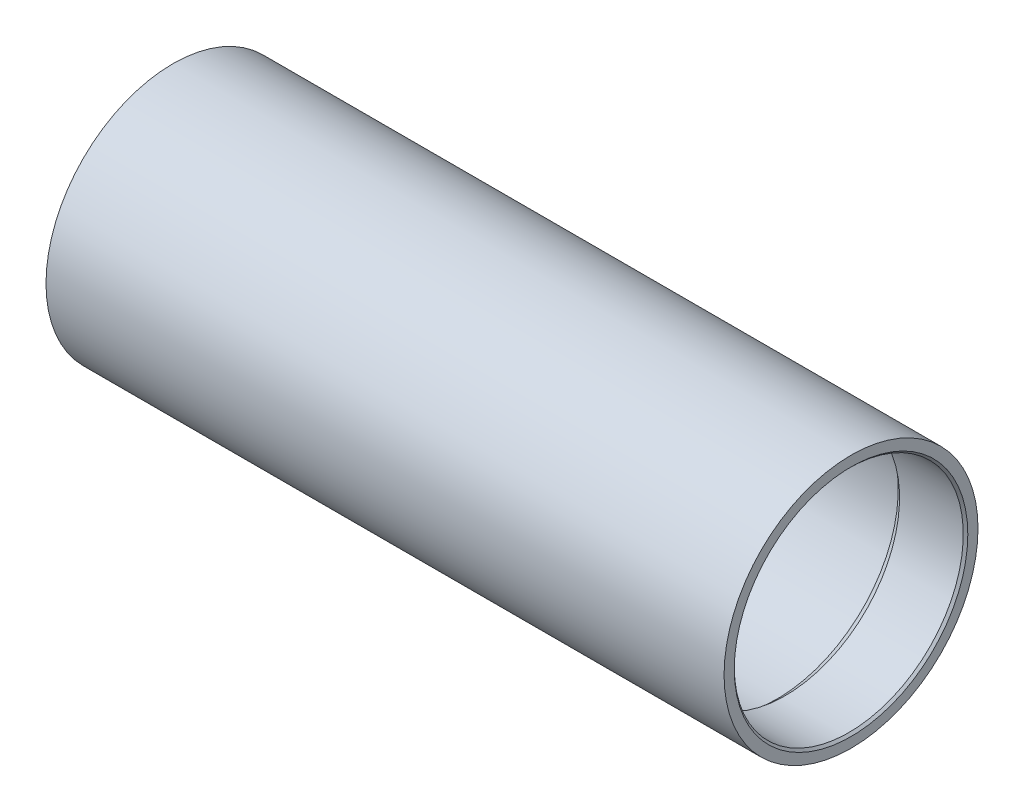
ISO-10303-21;
HEADER;
FILE_DESCRIPTION(('STEP AP214'),'2;1');
FILE_NAME('part.step','',(''),(''),'','','');
FILE_SCHEMA(('AUTOMOTIVE_DESIGN { 1 0 10303 214 1 1 1 1 }'));
ENDSEC;
DATA;
#1=APPLICATION_CONTEXT('core data for automotive mechanical design processes');
#2=APPLICATION_PROTOCOL_DEFINITION('international standard','automotive_design',2000,#1);
#3=PRODUCT_CONTEXT('',#1,'mechanical');
#4=PRODUCT('Part','Part','',(#3));
#5=PRODUCT_RELATED_PRODUCT_CATEGORY('part','',(#4));
#6=PRODUCT_DEFINITION_FORMATION('','',#4);
#7=PRODUCT_DEFINITION_CONTEXT('part definition',#1,'design');
#8=PRODUCT_DEFINITION('design','',#6,#7);
#9=PRODUCT_DEFINITION_SHAPE('','',#8);
#10=(LENGTH_UNIT() NAMED_UNIT(*) SI_UNIT(.MILLI.,.METRE.));
#11=(NAMED_UNIT(*) PLANE_ANGLE_UNIT() SI_UNIT($,.RADIAN.));
#12=(NAMED_UNIT(*) SI_UNIT($,.STERADIAN.) SOLID_ANGLE_UNIT());
#13=UNCERTAINTY_MEASURE_WITH_UNIT(LENGTH_MEASURE(1.E-05),#10,'distance_accuracy_value','');
#14=(GEOMETRIC_REPRESENTATION_CONTEXT(3) GLOBAL_UNCERTAINTY_ASSIGNED_CONTEXT((#13)) GLOBAL_UNIT_ASSIGNED_CONTEXT((#10,
#11,#12)) REPRESENTATION_CONTEXT('',''));
#15=CARTESIAN_POINT('',(0.,0.,0.));
#16=DIRECTION('',(0.,0.,1.));
#17=DIRECTION('',(1.,0.,0.));
#18=AXIS2_PLACEMENT_3D('',#15,#16,#17);
#19=CARTESIAN_POINT('',(0.,55.8,0.));
#20=DIRECTION('',(1.,0.,0.));
#21=DIRECTION('',(0.,0.,-1.));
#22=AXIS2_PLACEMENT_3D('',#19,#20,#21);
#23=PLANE('',#22);
#24=CARTESIAN_POINT('',(0.,0.,0.));
#25=DIRECTION('',(1.,0.,0.));
#26=DIRECTION('',(0.,0.,-1.));
#27=AXIS2_PLACEMENT_3D('',#24,#25,#26);
#28=CIRCLE('',#27,51.325);
#29=CARTESIAN_POINT('',(0.,0.,-51.325));
#30=VERTEX_POINT('',#29);
#31=EDGE_CURVE('E10',#30,#30,#28,.T.);
#32=ORIENTED_EDGE('',*,*,#31,.T.);
#33=EDGE_LOOP('',(#32));
#34=FACE_BOUND('',#33,.T.);
#35=CARTESIAN_POINT('',(0.,0.,0.));
#36=DIRECTION('',(-1.,0.,0.));
#37=DIRECTION('',(0.,0.,1.));
#38=AXIS2_PLACEMENT_3D('',#35,#36,#37);
#39=CIRCLE('',#38,55.8);
#40=CARTESIAN_POINT('',(0.,0.,55.8));
#41=VERTEX_POINT('',#40);
#42=EDGE_CURVE('E77',#41,#41,#39,.T.);
#43=ORIENTED_EDGE('',*,*,#42,.T.);
#44=EDGE_LOOP('',(#43));
#45=FACE_BOUND('',#44,.T.);
#46=ADVANCED_FACE('F30',(#34,#45),#23,.F.);
#47=CARTESIAN_POINT('',(0.,0.,0.));
#48=DIRECTION('',(-1.,0.,0.));
#49=DIRECTION('',(0.,0.,1.));
#50=AXIS2_PLACEMENT_3D('',#47,#48,#49);
#51=CYLINDRICAL_SURFACE('',#50,50.325);
#52=CARTESIAN_POINT('',(0.999999999999987,0.,0.));
#53=DIRECTION('',(1.,0.,0.));
#54=DIRECTION('',(0.,0.,-1.));
#55=AXIS2_PLACEMENT_3D('',#52,#53,#54);
#56=CIRCLE('',#55,50.325);
#57=CARTESIAN_POINT('',(0.999999999999987,0.,-50.325));
#58=VERTEX_POINT('',#57);
#59=EDGE_CURVE('E37',#58,#58,#56,.F.);
#60=ORIENTED_EDGE('',*,*,#59,.T.);
#61=EDGE_LOOP('',(#60));
#62=FACE_BOUND('',#61,.T.);
#63=CARTESIAN_POINT('',(29.,0.,0.));
#64=DIRECTION('',(-1.,0.,0.));
#65=DIRECTION('',(0.,0.,1.));
#66=AXIS2_PLACEMENT_3D('',#63,#64,#65);
#67=CIRCLE('',#66,50.325);
#68=CARTESIAN_POINT('',(29.,0.,50.325));
#69=VERTEX_POINT('',#68);
#70=EDGE_CURVE('E50',#69,#69,#67,.T.);
#71=ORIENTED_EDGE('',*,*,#70,.F.);
#72=EDGE_LOOP('',(#71));
#73=FACE_BOUND('',#72,.T.);
#74=ADVANCED_FACE('F101',(#62,#73),#51,.F.);
#75=CARTESIAN_POINT('',(29.,0.,0.));
#76=DIRECTION('',(1.,0.,0.));
#77=DIRECTION('',(0.,0.,-1.));
#78=AXIS2_PLACEMENT_3D('',#75,#76,#77);
#79=CONICAL_SURFACE('',#78,50.325,0.698131700797733);
#80=CARTESIAN_POINT('',(32.497796794264,0.,0.));
#81=DIRECTION('',(-1.,0.,0.));
#82=DIRECTION('',(0.,0.,1.));
#83=AXIS2_PLACEMENT_3D('',#80,#81,#82);
#84=CIRCLE('',#83,53.26);
#85=CARTESIAN_POINT('',(32.497796794264,0.,53.26));
#86=VERTEX_POINT('',#85);
#87=EDGE_CURVE('E53',#86,#86,#84,.T.);
#88=ORIENTED_EDGE('',*,*,#87,.F.);
#89=EDGE_LOOP('',(#88));
#90=FACE_BOUND('',#89,.T.);
#91=ORIENTED_EDGE('',*,*,#70,.T.);
#92=EDGE_LOOP('',(#91));
#93=FACE_BOUND('',#92,.T.);
#94=ADVANCED_FACE('F106',(#90,#93),#79,.F.);
#95=CARTESIAN_POINT('',(0.,0.,0.));
#96=DIRECTION('',(-1.,0.,0.));
#97=DIRECTION('',(0.,0.,1.));
#98=AXIS2_PLACEMENT_3D('',#95,#96,#97);
#99=CYLINDRICAL_SURFACE('',#98,53.26);
#100=CARTESIAN_POINT('',(133.806636880737,0.,0.));
#101=DIRECTION('',(-1.,0.,0.));
#102=DIRECTION('',(0.,0.,1.));
#103=AXIS2_PLACEMENT_3D('',#100,#101,#102);
#104=CIRCLE('',#103,53.26);
#105=CARTESIAN_POINT('',(133.806636880737,0.,53.26));
#106=VERTEX_POINT('',#105);
#107=EDGE_CURVE('E56',#106,#106,#104,.T.);
#108=ORIENTED_EDGE('',*,*,#107,.F.);
#109=EDGE_LOOP('',(#108));
#110=FACE_BOUND('',#109,.T.);
#111=ORIENTED_EDGE('',*,*,#87,.T.);
#112=EDGE_LOOP('',(#111));
#113=FACE_BOUND('',#112,.T.);
#114=ADVANCED_FACE('F147',(#110,#113),#99,.F.);
#115=CARTESIAN_POINT('',(133.806636880737,0.,0.));
#116=DIRECTION('',(-1.,0.,0.));
#117=DIRECTION('',(0.,0.,1.));
#118=AXIS2_PLACEMENT_3D('',#115,#116,#117);
#119=CONICAL_SURFACE('',#118,53.26,0.698131700797732);
#120=CARTESIAN_POINT('',(136.5,0.,0.));
#121=DIRECTION('',(-1.,0.,0.));
#122=DIRECTION('',(0.,0.,1.));
#123=AXIS2_PLACEMENT_3D('',#120,#121,#122);
#124=CIRCLE('',#123,51.);
#125=CARTESIAN_POINT('',(136.5,0.,51.));
#126=VERTEX_POINT('',#125);
#127=EDGE_CURVE('E59',#126,#126,#124,.T.);
#128=ORIENTED_EDGE('',*,*,#127,.F.);
#129=EDGE_LOOP('',(#128));
#130=FACE_BOUND('',#129,.T.);
#131=ORIENTED_EDGE('',*,*,#107,.T.);
#132=EDGE_LOOP('',(#131));
#133=FACE_BOUND('',#132,.T.);
#134=ADVANCED_FACE('F141',(#130,#133),#119,.F.);
#135=CARTESIAN_POINT('',(0.,0.,0.));
#136=DIRECTION('',(-1.,0.,0.));
#137=DIRECTION('',(0.,0.,1.));
#138=AXIS2_PLACEMENT_3D('',#135,#136,#137);
#139=CYLINDRICAL_SURFACE('',#138,51.);
#140=CARTESIAN_POINT('',(161.5,0.,0.));
#141=DIRECTION('',(-1.,0.,0.));
#142=DIRECTION('',(0.,0.,1.));
#143=AXIS2_PLACEMENT_3D('',#140,#141,#142);
#144=CIRCLE('',#143,51.);
#145=CARTESIAN_POINT('',(161.5,0.,51.));
#146=VERTEX_POINT('',#145);
#147=EDGE_CURVE('E62',#146,#146,#144,.T.);
#148=ORIENTED_EDGE('',*,*,#147,.F.);
#149=EDGE_LOOP('',(#148));
#150=FACE_BOUND('',#149,.T.);
#151=ORIENTED_EDGE('',*,*,#127,.T.);
#152=EDGE_LOOP('',(#151));
#153=FACE_BOUND('',#152,.T.);
#154=ADVANCED_FACE('F135',(#150,#153),#139,.F.);
#155=CARTESIAN_POINT('',(161.5,0.,0.));
#156=DIRECTION('',(1.,0.,0.));
#157=DIRECTION('',(0.,0.,-1.));
#158=AXIS2_PLACEMENT_3D('',#155,#156,#157);
#159=CONICAL_SURFACE('',#158,51.,0.872664625997162);
#160=CARTESIAN_POINT('',(163.396365166461,0.,0.));
#161=DIRECTION('',(-1.,0.,0.));
#162=DIRECTION('',(0.,0.,1.));
#163=AXIS2_PLACEMENT_3D('',#160,#161,#162);
#164=CIRCLE('',#163,53.26);
#165=CARTESIAN_POINT('',(163.396365166461,0.,53.26));
#166=VERTEX_POINT('',#165);
#167=EDGE_CURVE('E65',#166,#166,#164,.T.);
#168=ORIENTED_EDGE('',*,*,#167,.F.);
#169=EDGE_LOOP('',(#168));
#170=FACE_BOUND('',#169,.T.);
#171=ORIENTED_EDGE('',*,*,#147,.T.);
#172=EDGE_LOOP('',(#171));
#173=FACE_BOUND('',#172,.T.);
#174=ADVANCED_FACE('F129',(#170,#173),#159,.F.);
#175=CARTESIAN_POINT('',(0.,0.,0.));
#176=DIRECTION('',(-1.,0.,0.));
#177=DIRECTION('',(0.,0.,1.));
#178=AXIS2_PLACEMENT_3D('',#175,#176,#177);
#179=CYLINDRICAL_SURFACE('',#178,53.26);
#180=CARTESIAN_POINT('',(265.502203205736,0.,0.));
#181=DIRECTION('',(-1.,0.,0.));
#182=DIRECTION('',(0.,0.,1.));
#183=AXIS2_PLACEMENT_3D('',#180,#181,#182);
#184=CIRCLE('',#183,53.26);
#185=CARTESIAN_POINT('',(265.502203205736,0.,53.26));
#186=VERTEX_POINT('',#185);
#187=EDGE_CURVE('E68',#186,#186,#184,.T.);
#188=ORIENTED_EDGE('',*,*,#187,.F.);
#189=EDGE_LOOP('',(#188));
#190=FACE_BOUND('',#189,.T.);
#191=ORIENTED_EDGE('',*,*,#167,.T.);
#192=EDGE_LOOP('',(#191));
#193=FACE_BOUND('',#192,.T.);
#194=ADVANCED_FACE('F123',(#190,#193),#179,.F.);
#195=CARTESIAN_POINT('',(265.502203205736,0.,0.));
#196=DIRECTION('',(-1.,0.,0.));
#197=DIRECTION('',(0.,0.,1.));
#198=AXIS2_PLACEMENT_3D('',#195,#196,#197);
#199=CONICAL_SURFACE('',#198,53.26,0.698131700797734);
#200=CARTESIAN_POINT('',(269.,0.,0.));
#201=DIRECTION('',(-1.,0.,0.));
#202=DIRECTION('',(0.,0.,1.));
#203=AXIS2_PLACEMENT_3D('',#200,#201,#202);
#204=CIRCLE('',#203,50.325);
#205=CARTESIAN_POINT('',(269.,0.,50.325));
#206=VERTEX_POINT('',#205);
#207=EDGE_CURVE('E71',#206,#206,#204,.T.);
#208=ORIENTED_EDGE('',*,*,#207,.F.);
#209=EDGE_LOOP('',(#208));
#210=FACE_BOUND('',#209,.T.);
#211=ORIENTED_EDGE('',*,*,#187,.T.);
#212=EDGE_LOOP('',(#211));
#213=FACE_BOUND('',#212,.T.);
#214=ADVANCED_FACE('F97',(#210,#213),#199,.F.);
#215=CARTESIAN_POINT('',(0.,0.,0.));
#216=DIRECTION('',(-1.,0.,0.));
#217=DIRECTION('',(0.,0.,1.));
#218=AXIS2_PLACEMENT_3D('',#215,#216,#217);
#219=CYLINDRICAL_SURFACE('',#218,50.325);
#220=CARTESIAN_POINT('',(297.,0.,0.));
#221=DIRECTION('',(-1.,0.,0.));
#222=DIRECTION('',(0.,0.,1.));
#223=AXIS2_PLACEMENT_3D('',#220,#221,#222);
#224=CIRCLE('',#223,50.325);
#225=CARTESIAN_POINT('',(297.,0.,50.325));
#226=VERTEX_POINT('',#225);
#227=EDGE_CURVE('E41',#226,#226,#224,.F.);
#228=ORIENTED_EDGE('',*,*,#227,.T.);
#229=EDGE_LOOP('',(#228));
#230=FACE_BOUND('',#229,.T.);
#231=ORIENTED_EDGE('',*,*,#207,.T.);
#232=EDGE_LOOP('',(#231));
#233=FACE_BOUND('',#232,.T.);
#234=ADVANCED_FACE('F91',(#230,#233),#219,.F.);
#235=CARTESIAN_POINT('',(298.,50.325,0.));
#236=DIRECTION('',(-1.,0.,0.));
#237=DIRECTION('',(0.,0.,1.));
#238=AXIS2_PLACEMENT_3D('',#235,#236,#237);
#239=PLANE('',#238);
#240=CARTESIAN_POINT('',(298.,0.,0.));
#241=DIRECTION('',(-1.,0.,0.));
#242=DIRECTION('',(0.,0.,1.));
#243=AXIS2_PLACEMENT_3D('',#240,#241,#242);
#244=CIRCLE('',#243,51.325);
#245=CARTESIAN_POINT('',(298.,0.,51.325));
#246=VERTEX_POINT('',#245);
#247=EDGE_CURVE('E45',#246,#246,#244,.T.);
#248=ORIENTED_EDGE('',*,*,#247,.T.);
#249=EDGE_LOOP('',(#248));
#250=FACE_BOUND('',#249,.T.);
#251=CARTESIAN_POINT('',(298.,0.,0.));
#252=DIRECTION('',(-1.,0.,0.));
#253=DIRECTION('',(0.,0.,1.));
#254=AXIS2_PLACEMENT_3D('',#251,#252,#253);
#255=CIRCLE('',#254,55.8);
#256=CARTESIAN_POINT('',(298.,0.,55.8));
#257=VERTEX_POINT('',#256);
#258=EDGE_CURVE('E74',#257,#257,#255,.T.);
#259=ORIENTED_EDGE('',*,*,#258,.F.);
#260=EDGE_LOOP('',(#259));
#261=FACE_BOUND('',#260,.T.);
#262=ADVANCED_FACE('F86',(#250,#261),#239,.F.);
#263=CARTESIAN_POINT('',(0.,0.,0.));
#264=DIRECTION('',(-1.,0.,0.));
#265=DIRECTION('',(0.,0.,1.));
#266=AXIS2_PLACEMENT_3D('',#263,#264,#265);
#267=CYLINDRICAL_SURFACE('',#266,55.8);
#268=ORIENTED_EDGE('',*,*,#42,.F.);
#269=EDGE_LOOP('',(#268));
#270=FACE_BOUND('',#269,.T.);
#271=ORIENTED_EDGE('',*,*,#258,.T.);
#272=EDGE_LOOP('',(#271));
#273=FACE_BOUND('',#272,.T.);
#274=ADVANCED_FACE('F82',(#270,#273),#267,.T.);
#275=CARTESIAN_POINT('',(298.,0.,0.));
#276=DIRECTION('',(1.,0.,0.));
#277=DIRECTION('',(0.,0.,-1.));
#278=AXIS2_PLACEMENT_3D('',#275,#276,#277);
#279=CONICAL_SURFACE('',#278,51.325,0.785398163397455);
#280=ORIENTED_EDGE('',*,*,#227,.F.);
#281=EDGE_LOOP('',(#280));
#282=FACE_BOUND('',#281,.T.);
#283=ORIENTED_EDGE('',*,*,#247,.F.);
#284=EDGE_LOOP('',(#283));
#285=FACE_BOUND('',#284,.T.);
#286=ADVANCED_FACE('F85',(#282,#285),#279,.F.);
#287=CARTESIAN_POINT('',(0.999999999999987,0.,0.));
#288=DIRECTION('',(-1.,0.,0.));
#289=DIRECTION('',(0.,0.,1.));
#290=AXIS2_PLACEMENT_3D('',#287,#288,#289);
#291=CONICAL_SURFACE('',#290,50.325,0.785398163397445);
#292=ORIENTED_EDGE('',*,*,#31,.F.);
#293=EDGE_LOOP('',(#292));
#294=FACE_BOUND('',#293,.T.);
#295=ORIENTED_EDGE('',*,*,#59,.F.);
#296=EDGE_LOOP('',(#295));
#297=FACE_BOUND('',#296,.T.);
#298=ADVANCED_FACE('F32',(#294,#297),#291,.F.);
#299=CLOSED_SHELL('',(#46,#74,#94,#114,#134,#154,#174,#194,#214,#234,#262,#274,#286,#298));
#300=MANIFOLD_SOLID_BREP('B2',#299);
#301=ADVANCED_BREP_SHAPE_REPRESENTATION('',(#18,#300),#14);
#302=SHAPE_DEFINITION_REPRESENTATION(#9,#301);
ENDSEC;
END-ISO-10303-21;
